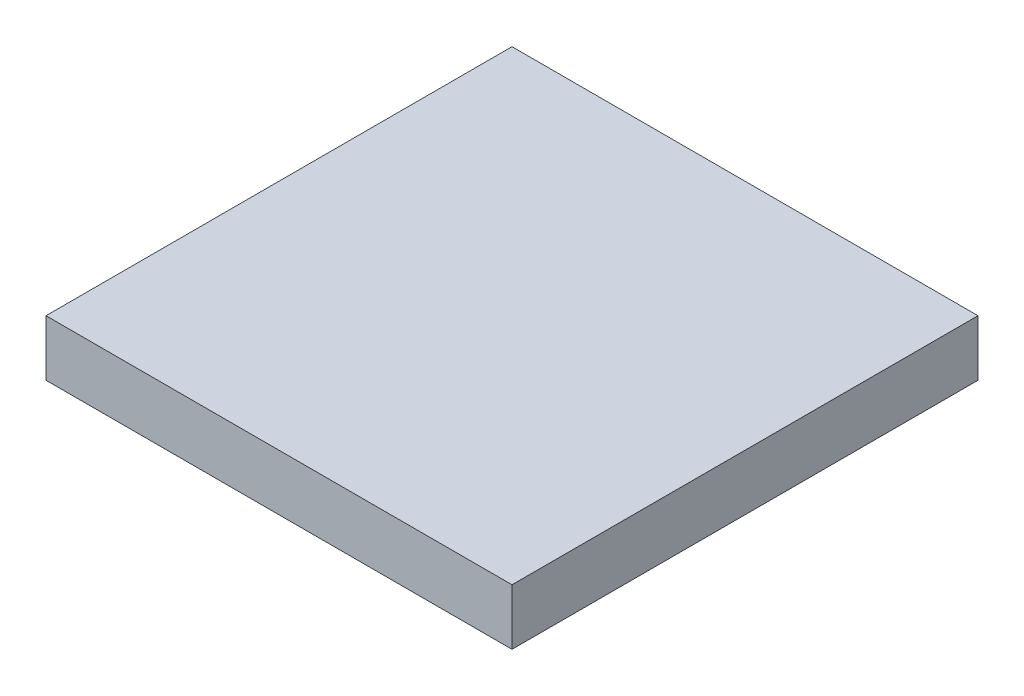
ISO-10303-21;
HEADER;
FILE_DESCRIPTION(('STEP AP214'),'2;1');
FILE_NAME('part.step','',(''),(''),'','','');
FILE_SCHEMA(('AUTOMOTIVE_DESIGN { 1 0 10303 214 1 1 1 1 }'));
ENDSEC;
DATA;
#1=APPLICATION_CONTEXT('core data for automotive mechanical design processes');
#2=APPLICATION_PROTOCOL_DEFINITION('international standard','automotive_design',2000,#1);
#3=PRODUCT_CONTEXT('',#1,'mechanical');
#4=PRODUCT('Part','Part','',(#3));
#5=PRODUCT_RELATED_PRODUCT_CATEGORY('part','',(#4));
#6=PRODUCT_DEFINITION_FORMATION('','',#4);
#7=PRODUCT_DEFINITION_CONTEXT('part definition',#1,'design');
#8=PRODUCT_DEFINITION('design','',#6,#7);
#9=PRODUCT_DEFINITION_SHAPE('','',#8);
#10=(LENGTH_UNIT() NAMED_UNIT(*) SI_UNIT(.MILLI.,.METRE.));
#11=(NAMED_UNIT(*) PLANE_ANGLE_UNIT() SI_UNIT($,.RADIAN.));
#12=(NAMED_UNIT(*) SI_UNIT($,.STERADIAN.) SOLID_ANGLE_UNIT());
#13=UNCERTAINTY_MEASURE_WITH_UNIT(LENGTH_MEASURE(1.E-05),#10,'distance_accuracy_value','');
#14=(GEOMETRIC_REPRESENTATION_CONTEXT(3) GLOBAL_UNCERTAINTY_ASSIGNED_CONTEXT((#13)) GLOBAL_UNIT_ASSIGNED_CONTEXT((#10,
#11,#12)) REPRESENTATION_CONTEXT('',''));
#15=CARTESIAN_POINT('',(0.,0.,0.));
#16=DIRECTION('',(0.,0.,1.));
#17=DIRECTION('',(1.,0.,0.));
#18=AXIS2_PLACEMENT_3D('',#15,#16,#17);
#19=CARTESIAN_POINT('',(0.,6.,0.));
#20=DIRECTION('',(1.,0.,0.));
#21=DIRECTION('',(0.,0.,-1.));
#22=AXIS2_PLACEMENT_3D('',#19,#20,#21);
#23=PLANE('',#22);
#24=DIRECTION('',(0.,0.,1.));
#25=VECTOR('',#24,1.);
#26=CARTESIAN_POINT('',(0.,0.,0.));
#27=LINE('',#26,#25);
#28=CARTESIAN_POINT('',(0.,0.,-50.));
#29=VERTEX_POINT('',#28);
#30=CARTESIAN_POINT('',(0.,0.,0.));
#31=VERTEX_POINT('',#30);
#32=EDGE_CURVE('E95',#29,#31,#27,.T.);
#33=ORIENTED_EDGE('',*,*,#32,.T.);
#34=DIRECTION('',(0.,-1.,0.));
#35=VECTOR('',#34,1.);
#36=CARTESIAN_POINT('',(0.,6.,0.));
#37=LINE('',#36,#35);
#38=CARTESIAN_POINT('',(0.,6.,0.));
#39=VERTEX_POINT('',#38);
#40=EDGE_CURVE('E11',#39,#31,#37,.T.);
#41=ORIENTED_EDGE('',*,*,#40,.F.);
#42=DIRECTION('',(0.,0.,1.));
#43=VECTOR('',#42,1.);
#44=CARTESIAN_POINT('',(0.,6.,0.));
#45=LINE('',#44,#43);
#46=CARTESIAN_POINT('',(0.,6.,-50.));
#47=VERTEX_POINT('',#46);
#48=EDGE_CURVE('E83',#47,#39,#45,.T.);
#49=ORIENTED_EDGE('',*,*,#48,.F.);
#50=DIRECTION('',(0.,-1.,0.));
#51=VECTOR('',#50,1.);
#52=CARTESIAN_POINT('',(0.,6.,-50.));
#53=LINE('',#52,#51);
#54=EDGE_CURVE('E91',#47,#29,#53,.T.);
#55=ORIENTED_EDGE('',*,*,#54,.T.);
#56=EDGE_LOOP('',(#33,#41,#49,#55));
#57=FACE_BOUND('',#56,.T.);
#58=ADVANCED_FACE('F32',(#57),#23,.F.);
#59=CARTESIAN_POINT('',(0.,6.,0.));
#60=DIRECTION('',(0.,0.,-1.));
#61=DIRECTION('',(-1.,0.,0.));
#62=AXIS2_PLACEMENT_3D('',#59,#60,#61);
#63=PLANE('',#62);
#64=DIRECTION('',(1.,0.,0.));
#65=VECTOR('',#64,1.);
#66=CARTESIAN_POINT('',(0.,0.,0.));
#67=LINE('',#66,#65);
#68=CARTESIAN_POINT('',(50.,0.,0.));
#69=VERTEX_POINT('',#68);
#70=EDGE_CURVE('E87',#31,#69,#67,.T.);
#71=ORIENTED_EDGE('',*,*,#70,.T.);
#72=DIRECTION('',(0.,-1.,0.));
#73=VECTOR('',#72,1.);
#74=CARTESIAN_POINT('',(50.,6.,0.));
#75=LINE('',#74,#73);
#76=CARTESIAN_POINT('',(50.,6.,0.));
#77=VERTEX_POINT('',#76);
#78=EDGE_CURVE('E40',#77,#69,#75,.T.);
#79=ORIENTED_EDGE('',*,*,#78,.F.);
#80=DIRECTION('',(1.,0.,0.));
#81=VECTOR('',#80,1.);
#82=CARTESIAN_POINT('',(0.,6.,0.));
#83=LINE('',#82,#81);
#84=EDGE_CURVE('E78',#39,#77,#83,.T.);
#85=ORIENTED_EDGE('',*,*,#84,.F.);
#86=ORIENTED_EDGE('',*,*,#40,.T.);
#87=EDGE_LOOP('',(#71,#79,#85,#86));
#88=FACE_BOUND('',#87,.T.);
#89=ADVANCED_FACE('F86',(#88),#63,.F.);
#90=CARTESIAN_POINT('',(50.,6.,0.));
#91=DIRECTION('',(-1.,0.,0.));
#92=DIRECTION('',(0.,0.,1.));
#93=AXIS2_PLACEMENT_3D('',#90,#91,#92);
#94=PLANE('',#93);
#95=DIRECTION('',(0.,0.,-1.));
#96=VECTOR('',#95,1.);
#97=CARTESIAN_POINT('',(50.,0.,0.));
#98=LINE('',#97,#96);
#99=CARTESIAN_POINT('',(50.,0.,-50.));
#100=VERTEX_POINT('',#99);
#101=EDGE_CURVE('E65',#69,#100,#98,.T.);
#102=ORIENTED_EDGE('',*,*,#101,.T.);
#103=DIRECTION('',(0.,-1.,0.));
#104=VECTOR('',#103,1.);
#105=CARTESIAN_POINT('',(50.,6.,-50.));
#106=LINE('',#105,#104);
#107=CARTESIAN_POINT('',(50.,6.,-50.));
#108=VERTEX_POINT('',#107);
#109=EDGE_CURVE('E88',#108,#100,#106,.T.);
#110=ORIENTED_EDGE('',*,*,#109,.F.);
#111=DIRECTION('',(0.,0.,-1.));
#112=VECTOR('',#111,1.);
#113=CARTESIAN_POINT('',(50.,6.,0.));
#114=LINE('',#113,#112);
#115=EDGE_CURVE('E81',#77,#108,#114,.T.);
#116=ORIENTED_EDGE('',*,*,#115,.F.);
#117=ORIENTED_EDGE('',*,*,#78,.T.);
#118=EDGE_LOOP('',(#102,#110,#116,#117));
#119=FACE_BOUND('',#118,.T.);
#120=ADVANCED_FACE('F89',(#119),#94,.F.);
#121=CARTESIAN_POINT('',(0.,6.,-50.));
#122=DIRECTION('',(0.,0.,1.));
#123=DIRECTION('',(1.,0.,0.));
#124=AXIS2_PLACEMENT_3D('',#121,#122,#123);
#125=PLANE('',#124);
#126=DIRECTION('',(-1.,0.,0.));
#127=VECTOR('',#126,1.);
#128=CARTESIAN_POINT('',(0.,0.,-50.));
#129=LINE('',#128,#127);
#130=EDGE_CURVE('E71',#100,#29,#129,.T.);
#131=ORIENTED_EDGE('',*,*,#130,.T.);
#132=ORIENTED_EDGE('',*,*,#54,.F.);
#133=DIRECTION('',(-1.,0.,0.));
#134=VECTOR('',#133,1.);
#135=CARTESIAN_POINT('',(0.,6.,-50.));
#136=LINE('',#135,#134);
#137=EDGE_CURVE('E48',#108,#47,#136,.T.);
#138=ORIENTED_EDGE('',*,*,#137,.F.);
#139=ORIENTED_EDGE('',*,*,#109,.T.);
#140=EDGE_LOOP('',(#131,#132,#138,#139));
#141=FACE_BOUND('',#140,.T.);
#142=ADVANCED_FACE('F102',(#141),#125,.F.);
#143=CARTESIAN_POINT('',(0.,6.,0.));
#144=DIRECTION('',(0.,-1.,0.));
#145=DIRECTION('',(0.,0.,-1.));
#146=AXIS2_PLACEMENT_3D('',#143,#144,#145);
#147=PLANE('',#146);
#148=ORIENTED_EDGE('',*,*,#48,.T.);
#149=ORIENTED_EDGE('',*,*,#84,.T.);
#150=ORIENTED_EDGE('',*,*,#115,.T.);
#151=ORIENTED_EDGE('',*,*,#137,.T.);
#152=EDGE_LOOP('',(#148,#149,#150,#151));
#153=FACE_BOUND('',#152,.T.);
#154=ADVANCED_FACE('F79',(#153),#147,.F.);
#155=CARTESIAN_POINT('',(0.,0.,0.));
#156=DIRECTION('',(0.,-1.,0.));
#157=DIRECTION('',(0.,0.,-1.));
#158=AXIS2_PLACEMENT_3D('',#155,#156,#157);
#159=PLANE('',#158);
#160=ORIENTED_EDGE('',*,*,#32,.F.);
#161=ORIENTED_EDGE('',*,*,#130,.F.);
#162=ORIENTED_EDGE('',*,*,#101,.F.);
#163=ORIENTED_EDGE('',*,*,#70,.F.);
#164=EDGE_LOOP('',(#160,#161,#162,#163));
#165=FACE_BOUND('',#164,.T.);
#166=ADVANCED_FACE('F105',(#165),#159,.T.);
#167=CLOSED_SHELL('',(#58,#89,#120,#142,#154,#166));
#168=MANIFOLD_SOLID_BREP('B2',#167);
#169=ADVANCED_BREP_SHAPE_REPRESENTATION('',(#18,#168),#14);
#170=SHAPE_DEFINITION_REPRESENTATION(#9,#169);
ENDSEC;
END-ISO-10303-21;
